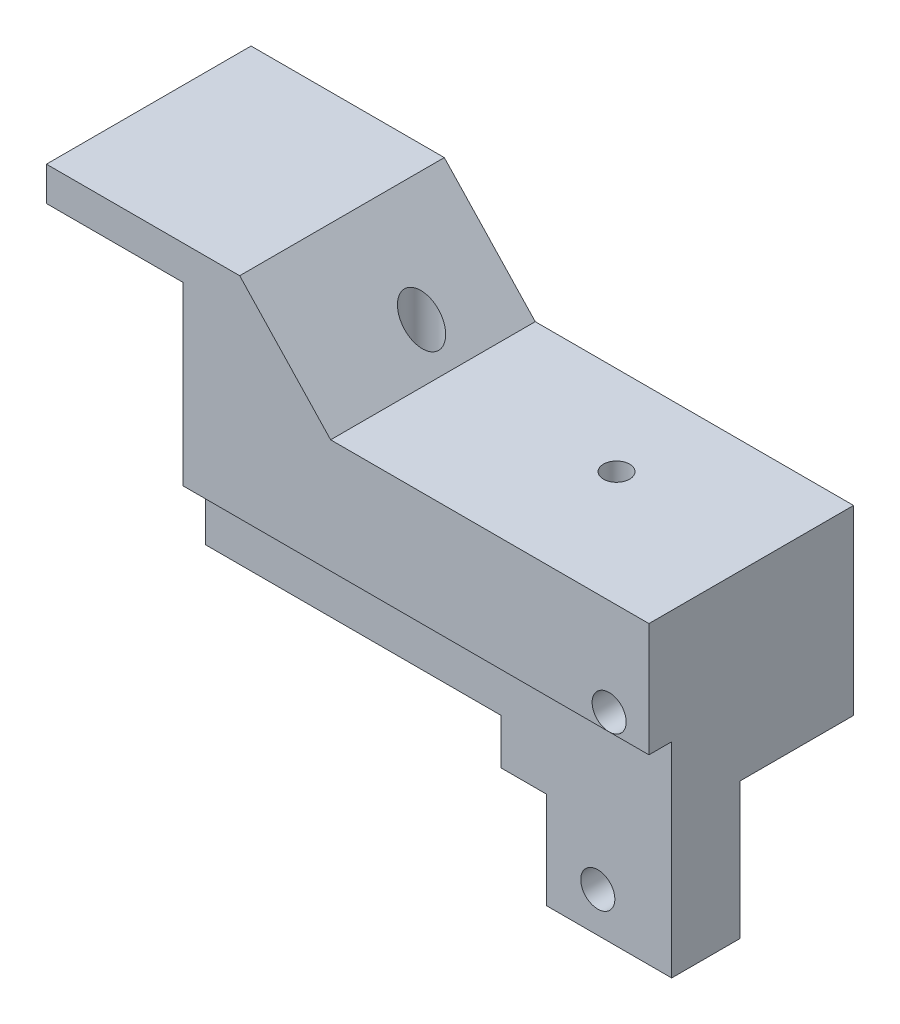
ISO-10303-21;
HEADER;
FILE_DESCRIPTION(('STEP AP214'),'2;1');
FILE_NAME('part.step','',(''),(''),'','','');
FILE_SCHEMA(('AUTOMOTIVE_DESIGN { 1 0 10303 214 1 1 1 1 }'));
ENDSEC;
DATA;
#1=APPLICATION_CONTEXT('core data for automotive mechanical design processes');
#2=APPLICATION_PROTOCOL_DEFINITION('international standard','automotive_design',2000,#1);
#3=PRODUCT_CONTEXT('',#1,'mechanical');
#4=PRODUCT('Part','Part','',(#3));
#5=PRODUCT_RELATED_PRODUCT_CATEGORY('part','',(#4));
#6=PRODUCT_DEFINITION_FORMATION('','',#4);
#7=PRODUCT_DEFINITION_CONTEXT('part definition',#1,'design');
#8=PRODUCT_DEFINITION('design','',#6,#7);
#9=PRODUCT_DEFINITION_SHAPE('','',#8);
#10=(LENGTH_UNIT() NAMED_UNIT(*) SI_UNIT(.MILLI.,.METRE.));
#11=(NAMED_UNIT(*) PLANE_ANGLE_UNIT() SI_UNIT($,.RADIAN.));
#12=(NAMED_UNIT(*) SI_UNIT($,.STERADIAN.) SOLID_ANGLE_UNIT());
#13=UNCERTAINTY_MEASURE_WITH_UNIT(LENGTH_MEASURE(1.E-05),#10,'distance_accuracy_value','');
#14=(GEOMETRIC_REPRESENTATION_CONTEXT(3) GLOBAL_UNCERTAINTY_ASSIGNED_CONTEXT((#13)) GLOBAL_UNIT_ASSIGNED_CONTEXT((#10,
#11,#12)) REPRESENTATION_CONTEXT('',''));
#15=CARTESIAN_POINT('',(0.,0.,0.));
#16=DIRECTION('',(0.,0.,1.));
#17=DIRECTION('',(1.,0.,0.));
#18=AXIS2_PLACEMENT_3D('',#15,#16,#17);
#19=CARTESIAN_POINT('',(-20.5,-14.,18.));
#20=DIRECTION('',(0.,1.,0.));
#21=DIRECTION('',(0.,0.,1.));
#22=AXIS2_PLACEMENT_3D('',#19,#20,#21);
#23=PLANE('',#22);
#24=DIRECTION('',(-1.,0.,0.));
#25=VECTOR('',#24,1.);
#26=CARTESIAN_POINT('',(20.5,-14.,10.));
#27=LINE('',#26,#25);
#28=CARTESIAN_POINT('',(20.5,-14.,10.));
#29=VERTEX_POINT('',#28);
#30=CARTESIAN_POINT('',(9.5,-14.,10.));
#31=VERTEX_POINT('',#30);
#32=EDGE_CURVE('E161',#29,#31,#27,.T.);
#33=ORIENTED_EDGE('',*,*,#32,.F.);
#34=DIRECTION('',(0.,0.,-1.));
#35=VECTOR('',#34,1.);
#36=CARTESIAN_POINT('',(20.5,-14.,18.));
#37=LINE('',#36,#35);
#38=CARTESIAN_POINT('',(20.5,-14.,16.));
#39=VERTEX_POINT('',#38);
#40=EDGE_CURVE('E210',#39,#29,#37,.T.);
#41=ORIENTED_EDGE('',*,*,#40,.F.);
#42=DIRECTION('',(1.,0.,0.));
#43=VECTOR('',#42,1.);
#44=CARTESIAN_POINT('',(-20.5,-14.,16.));
#45=LINE('',#44,#43);
#46=CARTESIAN_POINT('',(9.49999999999999,-14.,16.));
#47=VERTEX_POINT('',#46);
#48=EDGE_CURVE('E185',#47,#39,#45,.T.);
#49=ORIENTED_EDGE('',*,*,#48,.F.);
#50=DIRECTION('',(0.,0.,1.));
#51=VECTOR('',#50,1.);
#52=CARTESIAN_POINT('',(9.5,-14.,0.));
#53=LINE('',#52,#51);
#54=EDGE_CURVE('E180',#31,#47,#53,.T.);
#55=ORIENTED_EDGE('',*,*,#54,.F.);
#56=EDGE_LOOP('',(#33,#41,#49,#55));
#57=FACE_BOUND('',#56,.T.);
#58=ADVANCED_FACE('F39',(#57),#23,.F.);
#59=CARTESIAN_POINT('',(9.5,-14.,0.));
#60=DIRECTION('',(1.,0.,0.));
#61=DIRECTION('',(0.,0.,-1.));
#62=AXIS2_PLACEMENT_3D('',#59,#60,#61);
#63=PLANE('',#62);
#64=DIRECTION('',(0.,1.,0.));
#65=VECTOR('',#64,1.);
#66=CARTESIAN_POINT('',(9.5,-14.,10.));
#67=LINE('',#66,#65);
#68=CARTESIAN_POINT('',(9.5,-5.5,10.));
#69=VERTEX_POINT('',#68);
#70=EDGE_CURVE('E165',#31,#69,#67,.T.);
#71=ORIENTED_EDGE('',*,*,#70,.F.);
#72=ORIENTED_EDGE('',*,*,#54,.T.);
#73=DIRECTION('',(0.,-1.,0.));
#74=VECTOR('',#73,1.);
#75=CARTESIAN_POINT('',(9.5,-14.,16.));
#76=LINE('',#75,#74);
#77=CARTESIAN_POINT('',(9.5,-5.5,16.));
#78=VERTEX_POINT('',#77);
#79=EDGE_CURVE('E11',#78,#47,#76,.T.);
#80=ORIENTED_EDGE('',*,*,#79,.F.);
#81=DIRECTION('',(0.,0.,1.));
#82=VECTOR('',#81,1.);
#83=CARTESIAN_POINT('',(9.5,-5.5,0.));
#84=LINE('',#83,#82);
#85=EDGE_CURVE('E57',#69,#78,#84,.T.);
#86=ORIENTED_EDGE('',*,*,#85,.F.);
#87=EDGE_LOOP('',(#71,#72,#80,#86));
#88=FACE_BOUND('',#87,.T.);
#89=ADVANCED_FACE('F178',(#88),#63,.F.);
#90=CARTESIAN_POINT('',(14.,-10.5,0.));
#91=DIRECTION('',(0.,0.,1.));
#92=DIRECTION('',(1.,0.,0.));
#93=AXIS2_PLACEMENT_3D('',#90,#91,#92);
#94=CYLINDRICAL_SURFACE('',#93,1.5);
#95=CARTESIAN_POINT('',(14.,-10.5,16.));
#96=DIRECTION('',(0.,0.,1.));
#97=DIRECTION('',(1.,0.,0.));
#98=AXIS2_PLACEMENT_3D('',#95,#96,#97);
#99=CIRCLE('',#98,1.5);
#100=CARTESIAN_POINT('',(15.5,-10.5,16.));
#101=VERTEX_POINT('',#100);
#102=EDGE_CURVE('E280',#101,#101,#99,.T.);
#103=ORIENTED_EDGE('',*,*,#102,.T.);
#104=EDGE_LOOP('',(#103));
#105=FACE_BOUND('',#104,.T.);
#106=CARTESIAN_POINT('',(14.,-10.5,10.));
#107=DIRECTION('',(0.,0.,-1.));
#108=DIRECTION('',(-1.,0.,0.));
#109=AXIS2_PLACEMENT_3D('',#106,#107,#108);
#110=CIRCLE('',#109,1.5);
#111=CARTESIAN_POINT('',(12.5,-10.5,10.));
#112=VERTEX_POINT('',#111);
#113=EDGE_CURVE('E227',#112,#112,#110,.F.);
#114=ORIENTED_EDGE('',*,*,#113,.F.);
#115=EDGE_LOOP('',(#114));
#116=FACE_BOUND('',#115,.T.);
#117=ADVANCED_FACE('F442',(#105,#116),#94,.F.);
#118=CARTESIAN_POINT('',(5.5,-1.5,0.));
#119=DIRECTION('',(0.,1.,0.));
#120=DIRECTION('',(-1.,0.,0.));
#121=AXIS2_PLACEMENT_3D('',#118,#119,#120);
#122=PLANE('',#121);
#123=CARTESIAN_POINT('',(-10.,-1.5,7.5));
#124=DIRECTION('',(0.,-1.,0.));
#125=DIRECTION('',(1.,0.,0.));
#126=AXIS2_PLACEMENT_3D('',#123,#124,#125);
#127=CIRCLE('',#126,5.);
#128=CARTESIAN_POINT('',(-5.,-1.5,7.5));
#129=VERTEX_POINT('',#128);
#130=EDGE_CURVE('E235',#129,#129,#127,.T.);
#131=ORIENTED_EDGE('',*,*,#130,.F.);
#132=EDGE_LOOP('',(#131));
#133=FACE_BOUND('',#132,.T.);
#134=DIRECTION('',(1.,0.,0.));
#135=VECTOR('',#134,1.);
#136=CARTESIAN_POINT('',(5.5,-1.5,16.));
#137=LINE('',#136,#135);
#138=CARTESIAN_POINT('',(-20.5,-1.5,16.));
#139=VERTEX_POINT('',#138);
#140=CARTESIAN_POINT('',(5.5,-1.5,16.));
#141=VERTEX_POINT('',#140);
#142=EDGE_CURVE('E320',#139,#141,#137,.T.);
#143=ORIENTED_EDGE('',*,*,#142,.F.);
#144=DIRECTION('',(0.,0.,1.));
#145=VECTOR('',#144,1.);
#146=CARTESIAN_POINT('',(-20.5,-1.5,0.));
#147=LINE('',#146,#145);
#148=CARTESIAN_POINT('',(-20.5,-1.5,0.));
#149=VERTEX_POINT('',#148);
#150=EDGE_CURVE('E215',#149,#139,#147,.T.);
#151=ORIENTED_EDGE('',*,*,#150,.F.);
#152=DIRECTION('',(-1.,0.,0.));
#153=VECTOR('',#152,1.);
#154=CARTESIAN_POINT('',(5.5,-1.5,0.));
#155=LINE('',#154,#153);
#156=CARTESIAN_POINT('',(5.5,-1.5,0.));
#157=VERTEX_POINT('',#156);
#158=EDGE_CURVE('E187',#157,#149,#155,.T.);
#159=ORIENTED_EDGE('',*,*,#158,.F.);
#160=DIRECTION('',(0.,0.,1.));
#161=VECTOR('',#160,1.);
#162=CARTESIAN_POINT('',(5.5,-1.5,0.));
#163=LINE('',#162,#161);
#164=EDGE_CURVE('E379',#157,#141,#163,.T.);
#165=ORIENTED_EDGE('',*,*,#164,.T.);
#166=EDGE_LOOP('',(#143,#151,#159,#165));
#167=FACE_BOUND('',#166,.T.);
#168=ADVANCED_FACE('F440',(#133,#167),#122,.F.);
#169=CARTESIAN_POINT('',(5.5,-5.5,0.));
#170=DIRECTION('',(1.,0.,0.));
#171=DIRECTION('',(0.,0.,-1.));
#172=AXIS2_PLACEMENT_3D('',#169,#170,#171);
#173=PLANE('',#172);
#174=DIRECTION('',(0.,-1.,0.));
#175=VECTOR('',#174,1.);
#176=CARTESIAN_POINT('',(5.5,-5.5,16.));
#177=LINE('',#176,#175);
#178=CARTESIAN_POINT('',(5.5,-5.5,16.));
#179=VERTEX_POINT('',#178);
#180=EDGE_CURVE('E317',#141,#179,#177,.T.);
#181=ORIENTED_EDGE('',*,*,#180,.F.);
#182=ORIENTED_EDGE('',*,*,#164,.F.);
#183=DIRECTION('',(0.,1.,0.));
#184=VECTOR('',#183,1.);
#185=CARTESIAN_POINT('',(5.5,-5.5,0.));
#186=LINE('',#185,#184);
#187=CARTESIAN_POINT('',(5.5,-5.5,0.));
#188=VERTEX_POINT('',#187);
#189=EDGE_CURVE('E194',#188,#157,#186,.T.);
#190=ORIENTED_EDGE('',*,*,#189,.F.);
#191=DIRECTION('',(0.,0.,1.));
#192=VECTOR('',#191,1.);
#193=CARTESIAN_POINT('',(5.5,-5.5,0.));
#194=LINE('',#193,#192);
#195=EDGE_CURVE('E382',#188,#179,#194,.T.);
#196=ORIENTED_EDGE('',*,*,#195,.T.);
#197=EDGE_LOOP('',(#181,#182,#190,#196));
#198=FACE_BOUND('',#197,.T.);
#199=ADVANCED_FACE('F412',(#198),#173,.F.);
#200=CARTESIAN_POINT('',(9.5,-5.5,0.));
#201=DIRECTION('',(0.,1.,0.));
#202=DIRECTION('',(-1.,0.,0.));
#203=AXIS2_PLACEMENT_3D('',#200,#201,#202);
#204=PLANE('',#203);
#205=CARTESIAN_POINT('',(7.5,-5.5,7.85));
#206=DIRECTION('',(0.,-1.,0.));
#207=DIRECTION('',(1.,0.,0.));
#208=AXIS2_PLACEMENT_3D('',#205,#206,#207);
#209=CIRCLE('',#208,1.15);
#210=CARTESIAN_POINT('',(8.65,-5.5,7.85));
#211=VERTEX_POINT('',#210);
#212=EDGE_CURVE('E250',#211,#211,#209,.T.);
#213=ORIENTED_EDGE('',*,*,#212,.F.);
#214=EDGE_LOOP('',(#213));
#215=FACE_BOUND('',#214,.T.);
#216=DIRECTION('',(1.,0.,0.));
#217=VECTOR('',#216,1.);
#218=CARTESIAN_POINT('',(9.5,-5.5,16.));
#219=LINE('',#218,#217);
#220=EDGE_CURVE('E312',#179,#78,#219,.T.);
#221=ORIENTED_EDGE('',*,*,#220,.F.);
#222=ORIENTED_EDGE('',*,*,#195,.F.);
#223=DIRECTION('',(-1.,0.,0.));
#224=VECTOR('',#223,1.);
#225=CARTESIAN_POINT('',(9.5,-5.5,0.));
#226=LINE('',#225,#224);
#227=CARTESIAN_POINT('',(9.5,-5.5,0.));
#228=VERTEX_POINT('',#227);
#229=EDGE_CURVE('E360',#228,#188,#226,.T.);
#230=ORIENTED_EDGE('',*,*,#229,.F.);
#231=EDGE_CURVE('E191',#228,#69,#84,.T.);
#232=ORIENTED_EDGE('',*,*,#231,.T.);
#233=ORIENTED_EDGE('',*,*,#85,.T.);
#234=EDGE_LOOP('',(#221,#222,#230,#232,#233));
#235=FACE_BOUND('',#234,.T.);
#236=ADVANCED_FACE('F390',(#215,#235),#204,.F.);
#237=CARTESIAN_POINT('',(20.5,-14.,18.));
#238=DIRECTION('',(-1.,0.,0.));
#239=DIRECTION('',(0.,0.,1.));
#240=AXIS2_PLACEMENT_3D('',#237,#238,#239);
#241=PLANE('',#240);
#242=DIRECTION('',(0.,-1.,0.));
#243=VECTOR('',#242,1.);
#244=CARTESIAN_POINT('',(20.5,-2.,10.));
#245=LINE('',#244,#243);
#246=CARTESIAN_POINT('',(20.5,-2.,10.));
#247=VERTEX_POINT('',#246);
#248=EDGE_CURVE('E168',#247,#29,#245,.T.);
#249=ORIENTED_EDGE('',*,*,#248,.F.);
#250=DIRECTION('',(0.,0.,-1.));
#251=VECTOR('',#250,1.);
#252=CARTESIAN_POINT('',(20.5,-2.,10.));
#253=LINE('',#252,#251);
#254=CARTESIAN_POINT('',(20.5,-2.,0.));
#255=VERTEX_POINT('',#254);
#256=EDGE_CURVE('E231',#247,#255,#253,.T.);
#257=ORIENTED_EDGE('',*,*,#256,.T.);
#258=DIRECTION('',(0.,1.,0.));
#259=VECTOR('',#258,1.);
#260=CARTESIAN_POINT('',(20.5,-14.,0.));
#261=LINE('',#260,#259);
#262=CARTESIAN_POINT('',(20.5,14.,0.));
#263=VERTEX_POINT('',#262);
#264=EDGE_CURVE('E211',#255,#263,#261,.T.);
#265=ORIENTED_EDGE('',*,*,#264,.T.);
#266=DIRECTION('',(0.,0.,-1.));
#267=VECTOR('',#266,1.);
#268=CARTESIAN_POINT('',(20.5,14.,18.));
#269=LINE('',#268,#267);
#270=CARTESIAN_POINT('',(20.5,14.,18.));
#271=VERTEX_POINT('',#270);
#272=EDGE_CURVE('E49',#271,#263,#269,.T.);
#273=ORIENTED_EDGE('',*,*,#272,.F.);
#274=DIRECTION('',(0.,1.,0.));
#275=VECTOR('',#274,1.);
#276=CARTESIAN_POINT('',(20.5,-14.,18.));
#277=LINE('',#276,#275);
#278=CARTESIAN_POINT('',(20.5,4.,18.));
#279=VERTEX_POINT('',#278);
#280=EDGE_CURVE('E198',#279,#271,#277,.T.);
#281=ORIENTED_EDGE('',*,*,#280,.F.);
#282=DIRECTION('',(0.,0.,1.));
#283=VECTOR('',#282,1.);
#284=CARTESIAN_POINT('',(20.5,4.,16.));
#285=LINE('',#284,#283);
#286=CARTESIAN_POINT('',(20.5,4.,16.));
#287=VERTEX_POINT('',#286);
#288=EDGE_CURVE('E305',#287,#279,#285,.T.);
#289=ORIENTED_EDGE('',*,*,#288,.F.);
#290=DIRECTION('',(0.,1.,0.));
#291=VECTOR('',#290,1.);
#292=CARTESIAN_POINT('',(20.5,-14.,16.));
#293=LINE('',#292,#291);
#294=EDGE_CURVE('E294',#39,#287,#293,.T.);
#295=ORIENTED_EDGE('',*,*,#294,.F.);
#296=ORIENTED_EDGE('',*,*,#40,.T.);
#297=EDGE_LOOP('',(#249,#257,#265,#273,#281,#289,#295,#296));
#298=FACE_BOUND('',#297,.T.);
#299=ADVANCED_FACE('F41',(#298),#241,.F.);
#300=CARTESIAN_POINT('',(-20.5,14.,18.));
#301=DIRECTION('',(0.,-1.,0.));
#302=DIRECTION('',(0.,0.,-1.));
#303=AXIS2_PLACEMENT_3D('',#300,#301,#302);
#304=PLANE('',#303);
#305=CARTESIAN_POINT('',(7.5,14.,7.85));
#306=DIRECTION('',(0.,-1.,0.));
#307=DIRECTION('',(0.,0.,-1.));
#308=AXIS2_PLACEMENT_3D('',#305,#306,#307);
#309=CIRCLE('',#308,1.15);
#310=CARTESIAN_POINT('',(7.5,14.,6.7));
#311=VERTEX_POINT('',#310);
#312=EDGE_CURVE('E43',#311,#311,#309,.T.);
#313=ORIENTED_EDGE('',*,*,#312,.T.);
#314=EDGE_LOOP('',(#313));
#315=FACE_BOUND('',#314,.T.);
#316=DIRECTION('',(-1.,0.,0.));
#317=VECTOR('',#316,1.);
#318=CARTESIAN_POINT('',(-20.5,14.,0.));
#319=LINE('',#318,#317);
#320=CARTESIAN_POINT('',(-7.5,14.,0.));
#321=VERTEX_POINT('',#320);
#322=EDGE_CURVE('E214',#263,#321,#319,.T.);
#323=ORIENTED_EDGE('',*,*,#322,.T.);
#324=DIRECTION('',(0.,0.,1.));
#325=VECTOR('',#324,1.);
#326=CARTESIAN_POINT('',(-7.5,14.,-26.4054918530218));
#327=LINE('',#326,#325);
#328=CARTESIAN_POINT('',(-7.5,14.,18.));
#329=VERTEX_POINT('',#328);
#330=EDGE_CURVE('E347',#321,#329,#327,.T.);
#331=ORIENTED_EDGE('',*,*,#330,.T.);
#332=DIRECTION('',(-1.,0.,0.));
#333=VECTOR('',#332,1.);
#334=CARTESIAN_POINT('',(-20.5,14.,18.));
#335=LINE('',#334,#333);
#336=EDGE_CURVE('E201',#271,#329,#335,.T.);
#337=ORIENTED_EDGE('',*,*,#336,.F.);
#338=ORIENTED_EDGE('',*,*,#272,.T.);
#339=EDGE_LOOP('',(#323,#331,#337,#338));
#340=FACE_BOUND('',#339,.T.);
#341=ADVANCED_FACE('F433',(#315,#340),#304,.F.);
#342=CARTESIAN_POINT('',(-20.5,-14.,18.));
#343=DIRECTION('',(1.,0.,0.));
#344=DIRECTION('',(0.,0.,-1.));
#345=AXIS2_PLACEMENT_3D('',#342,#343,#344);
#346=PLANE('',#345);
#347=DIRECTION('',(0.,-1.,0.));
#348=VECTOR('',#347,1.);
#349=CARTESIAN_POINT('',(-20.5,3.99999999999999,16.));
#350=LINE('',#349,#348);
#351=CARTESIAN_POINT('',(-20.5,3.99999999999999,16.));
#352=VERTEX_POINT('',#351);
#353=EDGE_CURVE('E302',#352,#139,#350,.T.);
#354=ORIENTED_EDGE('',*,*,#353,.F.);
#355=DIRECTION('',(0.,0.,1.));
#356=VECTOR('',#355,1.);
#357=CARTESIAN_POINT('',(-20.5,3.99999999999999,16.));
#358=LINE('',#357,#356);
#359=CARTESIAN_POINT('',(-20.5,3.99999999999999,18.));
#360=VERTEX_POINT('',#359);
#361=EDGE_CURVE('E308',#352,#360,#358,.T.);
#362=ORIENTED_EDGE('',*,*,#361,.T.);
#363=DIRECTION('',(0.,-1.,0.));
#364=VECTOR('',#363,1.);
#365=CARTESIAN_POINT('',(-20.5,-14.,18.));
#366=LINE('',#365,#364);
#367=CARTESIAN_POINT('',(-20.5,19.5,18.));
#368=VERTEX_POINT('',#367);
#369=EDGE_CURVE('E206',#368,#360,#366,.T.);
#370=ORIENTED_EDGE('',*,*,#369,.F.);
#371=DIRECTION('',(0.,0.,1.));
#372=VECTOR('',#371,1.);
#373=CARTESIAN_POINT('',(-20.5,19.5,-26.4054918530218));
#374=LINE('',#373,#372);
#375=CARTESIAN_POINT('',(-20.5,19.5,0.));
#376=VERTEX_POINT('',#375);
#377=EDGE_CURVE('E352',#376,#368,#374,.T.);
#378=ORIENTED_EDGE('',*,*,#377,.F.);
#379=DIRECTION('',(0.,-1.,0.));
#380=VECTOR('',#379,1.);
#381=CARTESIAN_POINT('',(-20.5,-14.,0.));
#382=LINE('',#381,#380);
#383=EDGE_CURVE('E202',#376,#149,#382,.T.);
#384=ORIENTED_EDGE('',*,*,#383,.T.);
#385=ORIENTED_EDGE('',*,*,#150,.T.);
#386=EDGE_LOOP('',(#354,#362,#370,#378,#384,#385));
#387=FACE_BOUND('',#386,.T.);
#388=ADVANCED_FACE('F417',(#387),#346,.F.);
#389=CARTESIAN_POINT('',(0.,0.,18.));
#390=DIRECTION('',(0.,0.,-1.));
#391=DIRECTION('',(-1.,0.,0.));
#392=AXIS2_PLACEMENT_3D('',#389,#390,#391);
#393=PLANE('',#392);
#394=CARTESIAN_POINT('',(17.,5.501,18.));
#395=DIRECTION('',(0.,0.,1.));
#396=DIRECTION('',(1.,0.,0.));
#397=AXIS2_PLACEMENT_3D('',#394,#395,#396);
#398=CIRCLE('',#397,1.5);
#399=CARTESIAN_POINT('',(18.5,5.501,18.));
#400=VERTEX_POINT('',#399);
#401=EDGE_CURVE('E284',#400,#400,#398,.T.);
#402=ORIENTED_EDGE('',*,*,#401,.F.);
#403=EDGE_LOOP('',(#402));
#404=FACE_BOUND('',#403,.T.);
#405=ORIENTED_EDGE('',*,*,#369,.T.);
#406=DIRECTION('',(-1.,0.,0.));
#407=VECTOR('',#406,1.);
#408=CARTESIAN_POINT('',(20.5,4.,18.));
#409=LINE('',#408,#407);
#410=EDGE_CURVE('E291',#279,#360,#409,.T.);
#411=ORIENTED_EDGE('',*,*,#410,.F.);
#412=ORIENTED_EDGE('',*,*,#280,.T.);
#413=ORIENTED_EDGE('',*,*,#336,.T.);
#414=DIRECTION('',(-0.685364699004991,0.728199992692803,0.));
#415=VECTOR('',#414,1.);
#416=CARTESIAN_POINT('',(-15.5,22.5,18.));
#417=LINE('',#416,#415);
#418=CARTESIAN_POINT('',(-15.5,22.5,18.));
#419=VERTEX_POINT('',#418);
#420=EDGE_CURVE('E65',#329,#419,#417,.T.);
#421=ORIENTED_EDGE('',*,*,#420,.T.);
#422=DIRECTION('',(-1.,0.,0.));
#423=VECTOR('',#422,1.);
#424=CARTESIAN_POINT('',(-20.5,22.5,18.));
#425=LINE('',#424,#423);
#426=CARTESIAN_POINT('',(-32.5,22.5,18.));
#427=VERTEX_POINT('',#426);
#428=EDGE_CURVE('E325',#419,#427,#425,.T.);
#429=ORIENTED_EDGE('',*,*,#428,.T.);
#430=DIRECTION('',(0.,-1.,0.));
#431=VECTOR('',#430,1.);
#432=CARTESIAN_POINT('',(-32.5,22.5,18.));
#433=LINE('',#432,#431);
#434=CARTESIAN_POINT('',(-32.5,19.5,18.));
#435=VERTEX_POINT('',#434);
#436=EDGE_CURVE('E331',#427,#435,#433,.T.);
#437=ORIENTED_EDGE('',*,*,#436,.T.);
#438=DIRECTION('',(1.,0.,0.));
#439=VECTOR('',#438,1.);
#440=CARTESIAN_POINT('',(-32.5,19.5,18.));
#441=LINE('',#440,#439);
#442=EDGE_CURVE('E326',#435,#368,#441,.T.);
#443=ORIENTED_EDGE('',*,*,#442,.T.);
#444=EDGE_LOOP('',(#405,#411,#412,#413,#421,#429,#437,#443));
#445=FACE_BOUND('',#444,.T.);
#446=ADVANCED_FACE('F436',(#404,#445),#393,.F.);
#447=CARTESIAN_POINT('',(0.,0.,0.));
#448=DIRECTION('',(0.,0.,-1.));
#449=DIRECTION('',(-1.,0.,0.));
#450=AXIS2_PLACEMENT_3D('',#447,#448,#449);
#451=PLANE('',#450);
#452=DIRECTION('',(1.,0.,0.));
#453=VECTOR('',#452,1.);
#454=CARTESIAN_POINT('',(9.5,-2.,0.));
#455=LINE('',#454,#453);
#456=CARTESIAN_POINT('',(9.5,-2.,0.));
#457=VERTEX_POINT('',#456);
#458=EDGE_CURVE('E175',#457,#255,#455,.T.);
#459=ORIENTED_EDGE('',*,*,#458,.F.);
#460=DIRECTION('',(0.,1.,0.));
#461=VECTOR('',#460,1.);
#462=CARTESIAN_POINT('',(9.5,-14.,0.));
#463=LINE('',#462,#461);
#464=EDGE_CURVE('E255',#228,#457,#463,.T.);
#465=ORIENTED_EDGE('',*,*,#464,.F.);
#466=ORIENTED_EDGE('',*,*,#229,.T.);
#467=ORIENTED_EDGE('',*,*,#189,.T.);
#468=ORIENTED_EDGE('',*,*,#158,.T.);
#469=ORIENTED_EDGE('',*,*,#383,.F.);
#470=DIRECTION('',(1.,0.,0.));
#471=VECTOR('',#470,1.);
#472=CARTESIAN_POINT('',(-32.5,19.5,0.));
#473=LINE('',#472,#471);
#474=CARTESIAN_POINT('',(-32.5,19.5,0.));
#475=VERTEX_POINT('',#474);
#476=EDGE_CURVE('E348',#475,#376,#473,.T.);
#477=ORIENTED_EDGE('',*,*,#476,.F.);
#478=DIRECTION('',(0.,-1.,0.));
#479=VECTOR('',#478,1.);
#480=CARTESIAN_POINT('',(-32.5,22.5,0.));
#481=LINE('',#480,#479);
#482=CARTESIAN_POINT('',(-32.5,22.5,0.));
#483=VERTEX_POINT('',#482);
#484=EDGE_CURVE('E354',#483,#475,#481,.T.);
#485=ORIENTED_EDGE('',*,*,#484,.F.);
#486=DIRECTION('',(-1.,0.,0.));
#487=VECTOR('',#486,1.);
#488=CARTESIAN_POINT('',(-20.5,22.5,0.));
#489=LINE('',#488,#487);
#490=CARTESIAN_POINT('',(-15.5,22.5,0.));
#491=VERTEX_POINT('',#490);
#492=EDGE_CURVE('E330',#491,#483,#489,.T.);
#493=ORIENTED_EDGE('',*,*,#492,.F.);
#494=DIRECTION('',(-0.685364699004991,0.728199992692803,0.));
#495=VECTOR('',#494,1.);
#496=CARTESIAN_POINT('',(-15.5,22.5,0.));
#497=LINE('',#496,#495);
#498=EDGE_CURVE('E342',#321,#491,#497,.T.);
#499=ORIENTED_EDGE('',*,*,#498,.F.);
#500=ORIENTED_EDGE('',*,*,#322,.F.);
#501=ORIENTED_EDGE('',*,*,#264,.F.);
#502=EDGE_LOOP('',(#459,#465,#466,#467,#468,#469,#477,#485,#493,#499,#500,#501));
#503=FACE_BOUND('',#502,.T.);
#504=CARTESIAN_POINT('',(17.,5.501,0.));
#505=DIRECTION('',(0.,0.,-1.));
#506=DIRECTION('',(-1.,0.,0.));
#507=AXIS2_PLACEMENT_3D('',#504,#505,#506);
#508=CIRCLE('',#507,2.5);
#509=CARTESIAN_POINT('',(14.5,5.501,0.));
#510=VERTEX_POINT('',#509);
#511=EDGE_CURVE('E230',#510,#510,#508,.T.);
#512=ORIENTED_EDGE('',*,*,#511,.F.);
#513=EDGE_LOOP('',(#512));
#514=FACE_BOUND('',#513,.T.);
#515=ADVANCED_FACE('F397',(#503,#514),#451,.T.);
#516=CARTESIAN_POINT('',(-20.5,22.5,-26.4054918530218));
#517=DIRECTION('',(0.,1.,0.));
#518=DIRECTION('',(-1.,0.,0.));
#519=AXIS2_PLACEMENT_3D('',#516,#517,#518);
#520=PLANE('',#519);
#521=DIRECTION('',(0.,0.,1.));
#522=VECTOR('',#521,1.);
#523=CARTESIAN_POINT('',(-15.5,22.5,-26.4054918530218));
#524=LINE('',#523,#522);
#525=EDGE_CURVE('E346',#491,#419,#524,.T.);
#526=ORIENTED_EDGE('',*,*,#525,.F.);
#527=ORIENTED_EDGE('',*,*,#492,.T.);
#528=DIRECTION('',(0.,0.,1.));
#529=VECTOR('',#528,1.);
#530=CARTESIAN_POINT('',(-32.5,22.5,-26.4054918530218));
#531=LINE('',#530,#529);
#532=EDGE_CURVE('E341',#483,#427,#531,.T.);
#533=ORIENTED_EDGE('',*,*,#532,.T.);
#534=ORIENTED_EDGE('',*,*,#428,.F.);
#535=EDGE_LOOP('',(#526,#527,#533,#534));
#536=FACE_BOUND('',#535,.T.);
#537=ADVANCED_FACE('F429',(#536),#520,.T.);
#538=CARTESIAN_POINT('',(-32.5,22.5,-26.4054918530218));
#539=DIRECTION('',(-1.,0.,0.));
#540=DIRECTION('',(0.,0.,1.));
#541=AXIS2_PLACEMENT_3D('',#538,#539,#540);
#542=PLANE('',#541);
#543=ORIENTED_EDGE('',*,*,#532,.F.);
#544=ORIENTED_EDGE('',*,*,#484,.T.);
#545=DIRECTION('',(0.,0.,1.));
#546=VECTOR('',#545,1.);
#547=CARTESIAN_POINT('',(-32.5,19.5,-26.4054918530218));
#548=LINE('',#547,#546);
#549=EDGE_CURVE('E353',#475,#435,#548,.T.);
#550=ORIENTED_EDGE('',*,*,#549,.T.);
#551=ORIENTED_EDGE('',*,*,#436,.F.);
#552=EDGE_LOOP('',(#543,#544,#550,#551));
#553=FACE_BOUND('',#552,.T.);
#554=ADVANCED_FACE('F425',(#553),#542,.T.);
#555=CARTESIAN_POINT('',(-32.5,19.5,-26.4054918530218));
#556=DIRECTION('',(0.,-1.,0.));
#557=DIRECTION('',(0.,0.,-1.));
#558=AXIS2_PLACEMENT_3D('',#555,#556,#557);
#559=PLANE('',#558);
#560=ORIENTED_EDGE('',*,*,#549,.F.);
#561=ORIENTED_EDGE('',*,*,#476,.T.);
#562=ORIENTED_EDGE('',*,*,#377,.T.);
#563=ORIENTED_EDGE('',*,*,#442,.F.);
#564=EDGE_LOOP('',(#560,#561,#562,#563));
#565=FACE_BOUND('',#564,.T.);
#566=ADVANCED_FACE('F421',(#565),#559,.T.);
#567=CARTESIAN_POINT('',(-15.5,22.5,-26.4054918530218));
#568=DIRECTION('',(0.728199992692803,0.685364699004991,0.));
#569=DIRECTION('',(-0.685364699004991,0.728199992692803,0.));
#570=AXIS2_PLACEMENT_3D('',#567,#568,#569);
#571=PLANE('',#570);
#572=CARTESIAN_POINT('',(-10.,16.65625,7.5));
#573=DIRECTION('',(0.728199992692803,0.685364699004991,0.));
#574=DIRECTION('',(0.685364699004991,-0.728199992692803,0.));
#575=AXIS2_PLACEMENT_3D('',#572,#573,#574);
#576=ELLIPSE('',#575,2.18861578686164,1.5);
#577=CARTESIAN_POINT('',(-8.5,15.0625,7.5));
#578=VERTEX_POINT('',#577);
#579=EDGE_CURVE('E232',#578,#578,#576,.T.);
#580=ORIENTED_EDGE('',*,*,#579,.F.);
#581=EDGE_LOOP('',(#580));
#582=FACE_BOUND('',#581,.T.);
#583=ORIENTED_EDGE('',*,*,#330,.F.);
#584=ORIENTED_EDGE('',*,*,#498,.T.);
#585=ORIENTED_EDGE('',*,*,#525,.T.);
#586=ORIENTED_EDGE('',*,*,#420,.F.);
#587=EDGE_LOOP('',(#583,#584,#585,#586));
#588=FACE_BOUND('',#587,.T.);
#589=ADVANCED_FACE('F430',(#582,#588),#571,.T.);
#590=CARTESIAN_POINT('',(0.,0.,16.));
#591=DIRECTION('',(0.,0.,1.));
#592=DIRECTION('',(1.,0.,0.));
#593=AXIS2_PLACEMENT_3D('',#590,#591,#592);
#594=PLANE('',#593);
#595=ORIENTED_EDGE('',*,*,#102,.F.);
#596=EDGE_LOOP('',(#595));
#597=FACE_BOUND('',#596,.T.);
#598=ORIENTED_EDGE('',*,*,#142,.T.);
#599=ORIENTED_EDGE('',*,*,#180,.T.);
#600=ORIENTED_EDGE('',*,*,#220,.T.);
#601=ORIENTED_EDGE('',*,*,#79,.T.);
#602=ORIENTED_EDGE('',*,*,#48,.T.);
#603=ORIENTED_EDGE('',*,*,#294,.T.);
#604=DIRECTION('',(-1.,0.,0.));
#605=VECTOR('',#604,1.);
#606=CARTESIAN_POINT('',(20.5,4.,16.));
#607=LINE('',#606,#605);
#608=EDGE_CURVE('E298',#287,#352,#607,.T.);
#609=ORIENTED_EDGE('',*,*,#608,.T.);
#610=ORIENTED_EDGE('',*,*,#353,.T.);
#611=EDGE_LOOP('',(#598,#599,#600,#601,#602,#603,#609,#610));
#612=FACE_BOUND('',#611,.T.);
#613=ADVANCED_FACE('F410',(#597,#612),#594,.T.);
#614=CARTESIAN_POINT('',(20.5,4.,16.));
#615=DIRECTION('',(0.,1.,0.));
#616=DIRECTION('',(-1.,0.,0.));
#617=AXIS2_PLACEMENT_3D('',#614,#615,#616);
#618=PLANE('',#617);
#619=ORIENTED_EDGE('',*,*,#410,.T.);
#620=ORIENTED_EDGE('',*,*,#361,.F.);
#621=ORIENTED_EDGE('',*,*,#608,.F.);
#622=ORIENTED_EDGE('',*,*,#288,.T.);
#623=EDGE_LOOP('',(#619,#620,#621,#622));
#624=FACE_BOUND('',#623,.T.);
#625=ADVANCED_FACE('F438',(#624),#618,.F.);
#626=CARTESIAN_POINT('',(17.,5.501,7.));
#627=DIRECTION('',(0.,0.,1.));
#628=DIRECTION('',(1.,0.,0.));
#629=AXIS2_PLACEMENT_3D('',#626,#627,#628);
#630=CYLINDRICAL_SURFACE('',#629,1.5);
#631=CARTESIAN_POINT('',(17.,5.501,7.));
#632=DIRECTION('',(0.,0.,1.));
#633=DIRECTION('',(1.,0.,0.));
#634=AXIS2_PLACEMENT_3D('',#631,#632,#633);
#635=CIRCLE('',#634,1.5);
#636=CARTESIAN_POINT('',(18.5,5.501,7.));
#637=VERTEX_POINT('',#636);
#638=EDGE_CURVE('E276',#637,#637,#635,.T.);
#639=ORIENTED_EDGE('',*,*,#638,.F.);
#640=EDGE_LOOP('',(#639));
#641=FACE_BOUND('',#640,.T.);
#642=ORIENTED_EDGE('',*,*,#401,.T.);
#643=EDGE_LOOP('',(#642));
#644=FACE_BOUND('',#643,.T.);
#645=ADVANCED_FACE('F500',(#641,#644),#630,.F.);
#646=CARTESIAN_POINT('',(17.,5.501,7.));
#647=DIRECTION('',(0.,0.,-1.));
#648=DIRECTION('',(-1.,0.,0.));
#649=AXIS2_PLACEMENT_3D('',#646,#647,#648);
#650=PLANE('',#649);
#651=CARTESIAN_POINT('',(17.,5.501,7.));
#652=DIRECTION('',(0.,0.,-1.));
#653=DIRECTION('',(-1.,0.,0.));
#654=AXIS2_PLACEMENT_3D('',#651,#652,#653);
#655=CIRCLE('',#654,2.5);
#656=CARTESIAN_POINT('',(14.5,5.501,7.));
#657=VERTEX_POINT('',#656);
#658=EDGE_CURVE('E272',#657,#657,#655,.T.);
#659=ORIENTED_EDGE('',*,*,#658,.T.);
#660=EDGE_LOOP('',(#659));
#661=FACE_BOUND('',#660,.T.);
#662=ORIENTED_EDGE('',*,*,#638,.T.);
#663=EDGE_LOOP('',(#662));
#664=FACE_BOUND('',#663,.T.);
#665=ADVANCED_FACE('F497',(#661,#664),#650,.T.);
#666=CARTESIAN_POINT('',(17.,5.501,7.));
#667=DIRECTION('',(0.,0.,-1.));
#668=DIRECTION('',(-1.,0.,0.));
#669=AXIS2_PLACEMENT_3D('',#666,#667,#668);
#670=CYLINDRICAL_SURFACE('',#669,2.5);
#671=ORIENTED_EDGE('',*,*,#658,.F.);
#672=EDGE_LOOP('',(#671));
#673=FACE_BOUND('',#672,.T.);
#674=ORIENTED_EDGE('',*,*,#511,.T.);
#675=EDGE_LOOP('',(#674));
#676=FACE_BOUND('',#675,.T.);
#677=ADVANCED_FACE('F496',(#673,#676),#670,.F.);
#678=CARTESIAN_POINT('',(9.5,-14.,10.));
#679=DIRECTION('',(-1.,0.,0.));
#680=DIRECTION('',(0.,0.,1.));
#681=AXIS2_PLACEMENT_3D('',#678,#679,#680);
#682=PLANE('',#681);
#683=ORIENTED_EDGE('',*,*,#464,.T.);
#684=DIRECTION('',(0.,0.,-1.));
#685=VECTOR('',#684,1.);
#686=CARTESIAN_POINT('',(9.5,-2.,10.));
#687=LINE('',#686,#685);
#688=CARTESIAN_POINT('',(9.5,-2.,10.));
#689=VERTEX_POINT('',#688);
#690=EDGE_CURVE('E261',#689,#457,#687,.T.);
#691=ORIENTED_EDGE('',*,*,#690,.F.);
#692=EDGE_CURVE('E174',#69,#689,#67,.T.);
#693=ORIENTED_EDGE('',*,*,#692,.F.);
#694=ORIENTED_EDGE('',*,*,#231,.F.);
#695=EDGE_LOOP('',(#683,#691,#693,#694));
#696=FACE_BOUND('',#695,.T.);
#697=ADVANCED_FACE('F393',(#696),#682,.F.);
#698=CARTESIAN_POINT('',(0.,0.,10.));
#699=DIRECTION('',(0.,0.,-1.));
#700=DIRECTION('',(-1.,0.,0.));
#701=AXIS2_PLACEMENT_3D('',#698,#699,#700);
#702=PLANE('',#701);
#703=ORIENTED_EDGE('',*,*,#32,.T.);
#704=ORIENTED_EDGE('',*,*,#70,.T.);
#705=ORIENTED_EDGE('',*,*,#692,.T.);
#706=DIRECTION('',(1.,0.,0.));
#707=VECTOR('',#706,1.);
#708=CARTESIAN_POINT('',(9.5,-2.,10.));
#709=LINE('',#708,#707);
#710=EDGE_CURVE('E182',#689,#247,#709,.T.);
#711=ORIENTED_EDGE('',*,*,#710,.T.);
#712=ORIENTED_EDGE('',*,*,#248,.T.);
#713=EDGE_LOOP('',(#703,#704,#705,#711,#712));
#714=FACE_BOUND('',#713,.T.);
#715=ORIENTED_EDGE('',*,*,#113,.T.);
#716=EDGE_LOOP('',(#715));
#717=FACE_BOUND('',#716,.T.);
#718=ADVANCED_FACE('F163',(#714,#717),#702,.T.);
#719=CARTESIAN_POINT('',(9.5,-2.,10.));
#720=DIRECTION('',(0.,1.,0.));
#721=DIRECTION('',(-1.,0.,0.));
#722=AXIS2_PLACEMENT_3D('',#719,#720,#721);
#723=PLANE('',#722);
#724=ORIENTED_EDGE('',*,*,#458,.T.);
#725=ORIENTED_EDGE('',*,*,#256,.F.);
#726=ORIENTED_EDGE('',*,*,#710,.F.);
#727=ORIENTED_EDGE('',*,*,#690,.T.);
#728=EDGE_LOOP('',(#724,#725,#726,#727));
#729=FACE_BOUND('',#728,.T.);
#730=ADVANCED_FACE('F402',(#729),#723,.F.);
#731=CARTESIAN_POINT('',(-10.,2.5,7.5));
#732=DIRECTION('',(0.,-1.,0.));
#733=DIRECTION('',(1.,0.,0.));
#734=AXIS2_PLACEMENT_3D('',#731,#732,#733);
#735=CYLINDRICAL_SURFACE('',#734,5.);
#736=CARTESIAN_POINT('',(-10.,2.5,7.5));
#737=DIRECTION('',(0.,-1.,0.));
#738=DIRECTION('',(1.,0.,0.));
#739=AXIS2_PLACEMENT_3D('',#736,#737,#738);
#740=CIRCLE('',#739,5.);
#741=CARTESIAN_POINT('',(-5.,2.5,7.5));
#742=VERTEX_POINT('',#741);
#743=EDGE_CURVE('E242',#742,#742,#740,.T.);
#744=ORIENTED_EDGE('',*,*,#743,.F.);
#745=EDGE_LOOP('',(#744));
#746=FACE_BOUND('',#745,.T.);
#747=ORIENTED_EDGE('',*,*,#130,.T.);
#748=EDGE_LOOP('',(#747));
#749=FACE_BOUND('',#748,.T.);
#750=ADVANCED_FACE('F485',(#746,#749),#735,.F.);
#751=CARTESIAN_POINT('',(-10.,2.5,7.5));
#752=DIRECTION('',(0.,-1.,0.));
#753=DIRECTION('',(1.,0.,0.));
#754=AXIS2_PLACEMENT_3D('',#751,#752,#753);
#755=PLANE('',#754);
#756=CARTESIAN_POINT('',(-10.,2.5,7.5));
#757=DIRECTION('',(0.,-1.,0.));
#758=DIRECTION('',(1.,0.,0.));
#759=AXIS2_PLACEMENT_3D('',#756,#757,#758);
#760=CIRCLE('',#759,1.5);
#761=CARTESIAN_POINT('',(-8.5,2.5,7.5));
#762=VERTEX_POINT('',#761);
#763=EDGE_CURVE('E236',#762,#762,#760,.T.);
#764=ORIENTED_EDGE('',*,*,#763,.F.);
#765=EDGE_LOOP('',(#764));
#766=FACE_BOUND('',#765,.T.);
#767=ORIENTED_EDGE('',*,*,#743,.T.);
#768=EDGE_LOOP('',(#767));
#769=FACE_BOUND('',#768,.T.);
#770=ADVANCED_FACE('F479',(#766,#769),#755,.T.);
#771=CARTESIAN_POINT('',(-10.,22.5,7.5));
#772=DIRECTION('',(0.,-1.,0.));
#773=DIRECTION('',(1.,0.,0.));
#774=AXIS2_PLACEMENT_3D('',#771,#772,#773);
#775=CYLINDRICAL_SURFACE('',#774,1.5);
#776=ORIENTED_EDGE('',*,*,#579,.T.);
#777=EDGE_LOOP('',(#776));
#778=FACE_BOUND('',#777,.T.);
#779=ORIENTED_EDGE('',*,*,#763,.T.);
#780=EDGE_LOOP('',(#779));
#781=FACE_BOUND('',#780,.T.);
#782=ADVANCED_FACE('F473',(#778,#781),#775,.F.);
#783=CARTESIAN_POINT('',(7.49999999999999,22.5,7.85));
#784=DIRECTION('',(0.,-1.,0.));
#785=DIRECTION('',(1.,0.,0.));
#786=AXIS2_PLACEMENT_3D('',#783,#784,#785);
#787=CYLINDRICAL_SURFACE('',#786,1.15);
#788=ORIENTED_EDGE('',*,*,#212,.T.);
#789=EDGE_LOOP('',(#788));
#790=FACE_BOUND('',#789,.T.);
#791=ORIENTED_EDGE('',*,*,#312,.F.);
#792=EDGE_LOOP('',(#791));
#793=FACE_BOUND('',#792,.T.);
#794=ADVANCED_FACE('F471',(#790,#793),#787,.F.);
#795=CLOSED_SHELL('',(#58,#89,#117,#168,#199,#236,#299,#341,#388,#446,#515,#537,#554,#566,#589,
#613,#625,#645,#665,#677,#697,#718,#730,#750,#770,#782,#794));
#796=MANIFOLD_SOLID_BREP('B2',#795);
#797=ADVANCED_BREP_SHAPE_REPRESENTATION('',(#18,#796),#14);
#798=SHAPE_DEFINITION_REPRESENTATION(#9,#797);
ENDSEC;
END-ISO-10303-21;
